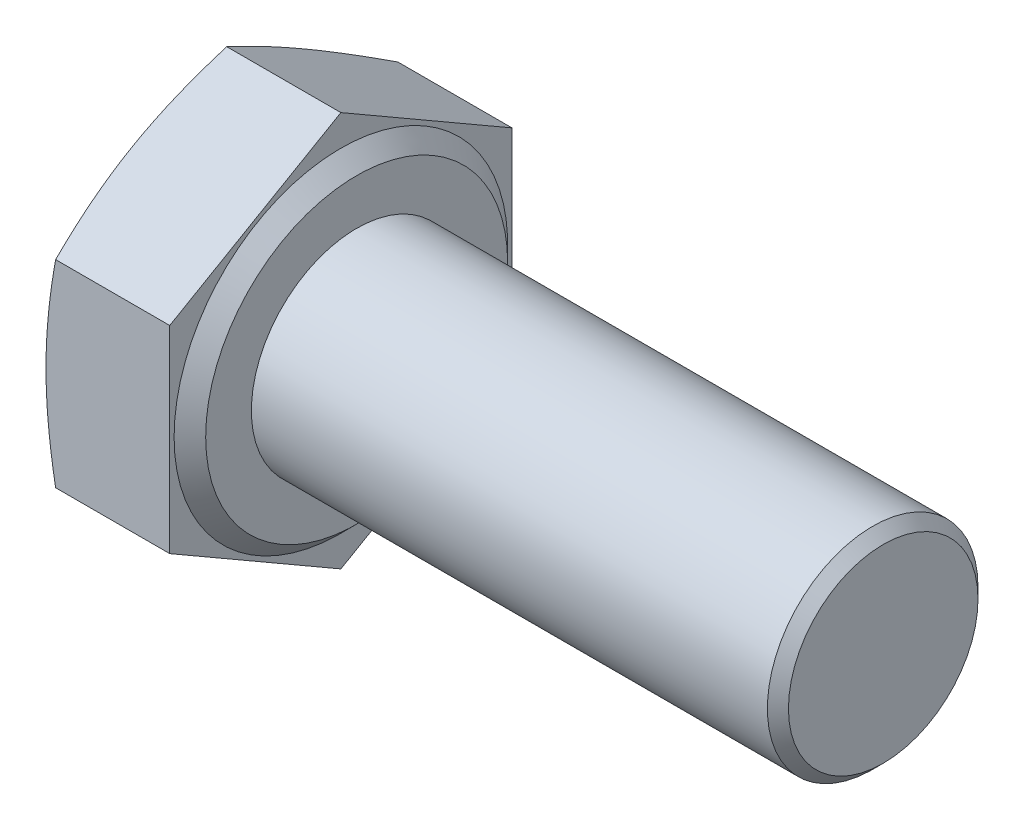
ISO-10303-21;
HEADER;
FILE_DESCRIPTION(('STEP AP214'),'2;1');
FILE_NAME('part.step','',(''),(''),'','','');
FILE_SCHEMA(('AUTOMOTIVE_DESIGN { 1 0 10303 214 1 1 1 1 }'));
ENDSEC;
DATA;
#1=APPLICATION_CONTEXT('core data for automotive mechanical design processes');
#2=APPLICATION_PROTOCOL_DEFINITION('international standard','automotive_design',2000,#1);
#3=PRODUCT_CONTEXT('',#1,'mechanical');
#4=PRODUCT('Part','Part','',(#3));
#5=PRODUCT_RELATED_PRODUCT_CATEGORY('part','',(#4));
#6=PRODUCT_DEFINITION_FORMATION('','',#4);
#7=PRODUCT_DEFINITION_CONTEXT('part definition',#1,'design');
#8=PRODUCT_DEFINITION('design','',#6,#7);
#9=PRODUCT_DEFINITION_SHAPE('','',#8);
#10=(LENGTH_UNIT() NAMED_UNIT(*) SI_UNIT(.MILLI.,.METRE.));
#11=(NAMED_UNIT(*) PLANE_ANGLE_UNIT() SI_UNIT($,.RADIAN.));
#12=(NAMED_UNIT(*) SI_UNIT($,.STERADIAN.) SOLID_ANGLE_UNIT());
#13=UNCERTAINTY_MEASURE_WITH_UNIT(LENGTH_MEASURE(1.E-05),#10,'distance_accuracy_value','');
#14=(GEOMETRIC_REPRESENTATION_CONTEXT(3) GLOBAL_UNCERTAINTY_ASSIGNED_CONTEXT((#13)) GLOBAL_UNIT_ASSIGNED_CONTEXT((#10,
#11,#12)) REPRESENTATION_CONTEXT('',''));
#15=CARTESIAN_POINT('',(0.,0.,0.));
#16=DIRECTION('',(0.,0.,1.));
#17=DIRECTION('',(1.,0.,0.));
#18=AXIS2_PLACEMENT_3D('',#15,#16,#17);
#19=CARTESIAN_POINT('',(5.3,-11.2583302491977,-6.5));
#20=DIRECTION('',(1.,0.,0.));
#21=DIRECTION('',(0.,0.,-1.));
#22=AXIS2_PLACEMENT_3D('',#19,#20,#21);
#23=PLANE('',#22);
#24=CARTESIAN_POINT('',(5.3,0.,0.));
#25=DIRECTION('',(-1.,0.,0.));
#26=DIRECTION('',(0.,0.,1.));
#27=AXIS2_PLACEMENT_3D('',#24,#25,#26);
#28=CIRCLE('',#27,5.735);
#29=CARTESIAN_POINT('',(5.3,0.,5.735));
#30=VERTEX_POINT('',#29);
#31=EDGE_CURVE('E253',#30,#30,#28,.T.);
#32=ORIENTED_EDGE('',*,*,#31,.F.);
#33=EDGE_LOOP('',(#32));
#34=FACE_BOUND('',#33,.T.);
#35=CARTESIAN_POINT('',(5.3,0.,0.));
#36=DIRECTION('',(1.,0.,0.));
#37=DIRECTION('',(0.,0.,-1.));
#38=AXIS2_PLACEMENT_3D('',#35,#36,#37);
#39=CIRCLE('',#38,4.);
#40=CARTESIAN_POINT('',(5.3,0.,-4.));
#41=VERTEX_POINT('',#40);
#42=EDGE_CURVE('E381',#41,#41,#39,.T.);
#43=ORIENTED_EDGE('',*,*,#42,.F.);
#44=EDGE_LOOP('',(#43));
#45=FACE_BOUND('',#44,.T.);
#46=ADVANCED_FACE('F36',(#34,#45),#23,.T.);
#47=CARTESIAN_POINT('',(5.3,-3.75277674973257,6.5));
#48=DIRECTION('',(0.,0.866025403784439,-0.5));
#49=DIRECTION('',(0.,0.5,0.866025403784439));
#50=AXIS2_PLACEMENT_3D('',#47,#48,#49);
#51=PLANE('',#50);
#52=CARTESIAN_POINT('',(0.366033571399917,-7.50566896951897,-0.000199999999999111));
#53=CARTESIAN_POINT('',(0.309444020524644,-7.35024872046989,0.268995767878022));
#54=CARTESIAN_POINT('',(0.257966025840877,-7.19431596160415,0.53907922879786));
#55=CARTESIAN_POINT('',(0.167398453510307,-6.88143655010517,1.08100226615635));
#56=CARTESIAN_POINT('',(0.128318569974497,-6.72448920151499,1.35284304802776));
#57=CARTESIAN_POINT('',(0.0651079760464742,-6.41132237124561,1.89526390929962));
#58=CARTESIAN_POINT('',(0.0408393932631412,-6.25511004161362,2.16583160099093));
#59=CARTESIAN_POINT('',(0.00828840244356363,-5.94232007682223,2.70759971210731));
#60=CARTESIAN_POINT('',(0.,-5.78574260071054,2.97879985605365));
#61=CARTESIAN_POINT('',(0.,-5.47258764848716,3.52120014394635));
#62=CARTESIAN_POINT('',(0.00828840244356352,-5.31601017237547,3.79240028789269));
#63=CARTESIAN_POINT('',(0.0408393932631413,-5.00322020758407,4.33416839900907));
#64=CARTESIAN_POINT('',(0.0651079760464745,-4.84700787795208,4.60473609070038));
#65=CARTESIAN_POINT('',(0.128318569974498,-4.53384104768271,5.14715695197224));
#66=CARTESIAN_POINT('',(0.167398453510307,-4.37689369909253,5.41899773384365));
#67=CARTESIAN_POINT('',(0.257966025840878,-4.06401428759354,5.96092077120214));
#68=CARTESIAN_POINT('',(0.309444020524644,-3.90808152872781,6.23100423212198));
#69=CARTESIAN_POINT('',(0.366033571399917,-3.75266127967873,6.5002));
#70=B_SPLINE_CURVE_WITH_KNOTS('',3,(#52,#53,#54,#55,#56,#57,#58,#59,#60,#61,#62,#63,#64,#65,#66,
#67,#68,#69),.UNSPECIFIED.,.F.,.F.,(4,2,2,2,2,2,2,2,4),(0.,0.947946776379686,1.89663293805397,
2.83634783106806,3.77571015417899,4.71507247728992,5.65478737030401,6.6034735319783,
7.55142030835798),.UNSPECIFIED.);
#71=CARTESIAN_POINT('',(0.365991542767518,-7.50555349946513,0.));
#72=VERTEX_POINT('',#71);
#73=CARTESIAN_POINT('',(0.,-5.62916512459885,3.25));
#74=VERTEX_POINT('',#73);
#75=EDGE_CURVE('E170',#72,#74,#70,.T.);
#76=ORIENTED_EDGE('',*,*,#75,.F.);
#77=DIRECTION('',(-1.,0.,0.));
#78=VECTOR('',#77,1.);
#79=CARTESIAN_POINT('',(5.3,-7.50555349946513,0.));
#80=LINE('',#79,#78);
#81=CARTESIAN_POINT('',(4.7,-7.50555349946513,0.));
#82=VERTEX_POINT('',#81);
#83=EDGE_CURVE('E145',#82,#72,#80,.T.);
#84=ORIENTED_EDGE('',*,*,#83,.F.);
#85=DIRECTION('',(0.,-0.5,-0.866025403784439));
#86=VECTOR('',#85,1.);
#87=CARTESIAN_POINT('',(4.7,-3.75277674973257,6.5));
#88=LINE('',#87,#86);
#89=CARTESIAN_POINT('',(4.7,-3.75277674973257,6.5));
#90=VERTEX_POINT('',#89);
#91=EDGE_CURVE('E136',#90,#82,#88,.T.);
#92=ORIENTED_EDGE('',*,*,#91,.F.);
#93=DIRECTION('',(-1.,0.,0.));
#94=VECTOR('',#93,1.);
#95=CARTESIAN_POINT('',(5.3,-3.75277674973257,6.5));
#96=LINE('',#95,#94);
#97=CARTESIAN_POINT('',(0.365991542767518,-3.75277674973257,6.5));
#98=VERTEX_POINT('',#97);
#99=EDGE_CURVE('E131',#90,#98,#96,.T.);
#100=ORIENTED_EDGE('',*,*,#99,.T.);
#101=EDGE_CURVE('E124',#74,#98,#70,.T.);
#102=ORIENTED_EDGE('',*,*,#101,.F.);
#103=EDGE_LOOP('',(#76,#84,#92,#100,#102));
#104=FACE_BOUND('',#103,.T.);
#105=ADVANCED_FACE('F233',(#104),#51,.F.);
#106=CARTESIAN_POINT('',(5.3,-7.50555349946513,0.));
#107=DIRECTION('',(0.,0.866025403784439,0.5));
#108=DIRECTION('',(0.,-0.5,0.866025403784439));
#109=AXIS2_PLACEMENT_3D('',#106,#107,#108);
#110=PLANE('',#109);
#111=CARTESIAN_POINT('',(0.366033571399918,-3.75266127967873,-6.5002));
#112=CARTESIAN_POINT('',(0.309444020524644,-3.90808152872781,-6.23100423212198));
#113=CARTESIAN_POINT('',(0.257966025840878,-4.06401428759355,-5.96092077120214));
#114=CARTESIAN_POINT('',(0.167398453510308,-4.37689369909253,-5.41899773384365));
#115=CARTESIAN_POINT('',(0.128318569974498,-4.53384104768271,-5.14715695197224));
#116=CARTESIAN_POINT('',(0.0651079760464751,-4.84700787795209,-4.60473609070038));
#117=CARTESIAN_POINT('',(0.0408393932631418,-5.00322020758408,-4.33416839900907));
#118=CARTESIAN_POINT('',(0.00828840244356392,-5.31601017237547,-3.79240028789269));
#119=CARTESIAN_POINT('',(0.,-5.47258764848716,-3.52120014394635));
#120=CARTESIAN_POINT('',(0.,-5.78574260071054,-2.97879985605365));
#121=CARTESIAN_POINT('',(0.00828840244356391,-5.94232007682223,-2.7075997121073));
#122=CARTESIAN_POINT('',(0.0408393932631417,-6.25511004161362,-2.16583160099092));
#123=CARTESIAN_POINT('',(0.0651079760464749,-6.41132237124561,-1.89526390929962));
#124=CARTESIAN_POINT('',(0.128318569974498,-6.72448920151499,-1.35284304802776));
#125=CARTESIAN_POINT('',(0.167398453510307,-6.88143655010517,-1.08100226615635));
#126=CARTESIAN_POINT('',(0.257966025840877,-7.19431596160415,-0.539079228797858));
#127=CARTESIAN_POINT('',(0.309444020524644,-7.35024872046989,-0.26899576787802));
#128=CARTESIAN_POINT('',(0.366033571399917,-7.50566896951897,0.000200000000000513));
#129=B_SPLINE_CURVE_WITH_KNOTS('',3,(#111,#112,#113,#114,#115,#116,#117,#118,#119,#120,#121,
#122,#123,#124,#125,#126,#127,#128),.UNSPECIFIED.,.F.,.F.,(4,2,2,2,2,2,2,2,4),(0.,
0.947946776379686,1.89663293805397,2.83634783106806,3.77571015417899,4.71507247728992,
5.65478737030401,6.6034735319783,7.55142030835798),.UNSPECIFIED.);
#130=CARTESIAN_POINT('',(0.365991542767518,-3.75277674973257,-6.5));
#131=VERTEX_POINT('',#130);
#132=CARTESIAN_POINT('',(0.,-5.62916512459885,-3.25));
#133=VERTEX_POINT('',#132);
#134=EDGE_CURVE('E176',#131,#133,#129,.T.);
#135=ORIENTED_EDGE('',*,*,#134,.F.);
#136=DIRECTION('',(-1.,0.,0.));
#137=VECTOR('',#136,1.);
#138=CARTESIAN_POINT('',(5.3,-3.75277674973257,-6.5));
#139=LINE('',#138,#137);
#140=CARTESIAN_POINT('',(4.7,-3.75277674973257,-6.5));
#141=VERTEX_POINT('',#140);
#142=EDGE_CURVE('E142',#141,#131,#139,.T.);
#143=ORIENTED_EDGE('',*,*,#142,.F.);
#144=DIRECTION('',(0.,0.5,-0.866025403784439));
#145=VECTOR('',#144,1.);
#146=CARTESIAN_POINT('',(4.7,-7.50555349946513,0.));
#147=LINE('',#146,#145);
#148=EDGE_CURVE('E262',#82,#141,#147,.T.);
#149=ORIENTED_EDGE('',*,*,#148,.F.);
#150=ORIENTED_EDGE('',*,*,#83,.T.);
#151=EDGE_CURVE('E168',#133,#72,#129,.T.);
#152=ORIENTED_EDGE('',*,*,#151,.F.);
#153=EDGE_LOOP('',(#135,#143,#149,#150,#152));
#154=FACE_BOUND('',#153,.T.);
#155=ADVANCED_FACE('F185',(#154),#110,.F.);
#156=CARTESIAN_POINT('',(5.3,-3.75277674973257,-6.5));
#157=DIRECTION('',(0.,0.,1.));
#158=DIRECTION('',(0.,-1.,0.));
#159=AXIS2_PLACEMENT_3D('',#156,#157,#158);
#160=PLANE('',#159);
#161=CARTESIAN_POINT('',(1.95571401153663,-9.93603441979221,-6.5));
#162=CARTESIAN_POINT('',(1.86616567875673,-9.64195086953644,-6.5));
#163=CARTESIAN_POINT('',(1.77766225828461,-9.34754322845582,-6.5));
#164=CARTESIAN_POINT('',(1.60332328599293,-8.75791476814704,-6.5));
#165=CARTESIAN_POINT('',(1.51748794528308,-8.4626938865736,-6.5));
#166=CARTESIAN_POINT('',(1.3489203902146,-7.87076864639478,-6.5));
#167=CARTESIAN_POINT('',(1.26619426431368,-7.57406254766227,-6.5));
#168=CARTESIAN_POINT('',(1.10481363643384,-6.9795466370098,-6.5));
#169=CARTESIAN_POINT('',(1.02615906134927,-6.68173684500988,-6.5));
#170=CARTESIAN_POINT('',(0.874868353864858,-6.0884951603723,-6.5));
#171=CARTESIAN_POINT('',(0.802169973926058,-5.79307922138507,-6.5));
#172=CARTESIAN_POINT('',(0.662962609513869,-5.20077731548877,-6.5));
#173=CARTESIAN_POINT('',(0.596453729200673,-4.90389132392938,-6.5));
#174=CARTESIAN_POINT('',(0.471175956763028,-4.3085828816641,-6.5));
#175=CARTESIAN_POINT('',(0.412404424419993,-4.01016099136059,-6.5));
#176=CARTESIAN_POINT('',(0.304390922908062,-3.41158466459654,-6.5));
#177=CARTESIAN_POINT('',(0.255148634453813,-3.1114302865316,-6.5));
#178=CARTESIAN_POINT('',(0.173069796227443,-2.54318759814721,-6.5));
#179=CARTESIAN_POINT('',(0.139012858796123,-2.2752772220122,-6.5));
#180=CARTESIAN_POINT('',(0.081362576226893,-1.73832361178718,-6.5));
#181=CARTESIAN_POINT('',(0.0577689261779796,-1.46928041093954,-6.5));
#182=CARTESIAN_POINT('',(0.0221814401839781,-0.930606870053421,-6.5));
#183=CARTESIAN_POINT('',(0.0101793995170961,-0.660977080895949,-6.5));
#184=CARTESIAN_POINT('',(-0.00161720684022572,-0.12144774373269,-6.5));
#185=CARTESIAN_POINT('',(-0.00141185873888266,0.148451802354621,-6.5));
#186=CARTESIAN_POINT('',(0.0112271247261067,0.689329214219691,-6.5));
#187=CARTESIAN_POINT('',(0.0237227706095074,0.960305606843374,-6.5));
#188=CARTESIAN_POINT('',(0.0603672970671052,1.50146246694377,-6.5));
#189=CARTESIAN_POINT('',(0.0845164576092169,1.77164291514155,-6.5));
#190=CARTESIAN_POINT('',(0.143338326857308,2.31107447569056,-6.5));
#191=CARTESIAN_POINT('',(0.178020074424773,2.58032458812684,-6.5));
#192=CARTESIAN_POINT('',(0.256500333618585,3.1174778193519,-6.5));
#193=CARTESIAN_POINT('',(0.300298894108137,3.38538093091332,-6.5));
#194=CARTESIAN_POINT('',(0.398107689520772,3.93393795895059,-6.5));
#195=CARTESIAN_POINT('',(0.452535533885652,4.21451675121541,-6.5));
#196=CARTESIAN_POINT('',(0.568396435461318,4.77423349044454,-6.5));
#197=CARTESIAN_POINT('',(0.629830020802258,5.05337132712171,-6.5));
#198=CARTESIAN_POINT('',(0.75841232428275,5.61040510315648,-6.5));
#199=CARTESIAN_POINT('',(0.825562702223159,5.88830065701456,-6.5));
#200=CARTESIAN_POINT('',(0.96448662108934,6.44292100824928,-6.5));
#201=CARTESIAN_POINT('',(1.03626005120185,6.71964583351865,-6.5));
#202=CARTESIAN_POINT('',(1.18365878714095,7.27244327517417,-6.5));
#203=CARTESIAN_POINT('',(1.25928890210724,7.54851460470713,-6.5));
#204=CARTESIAN_POINT('',(1.41363061537329,8.0997961525575,-6.5));
#205=CARTESIAN_POINT('',(1.49234225905049,8.37500635812984,-6.5));
#206=CARTESIAN_POINT('',(1.73221562213793,9.19944034893931,-6.5));
#207=CARTESIAN_POINT('',(1.89714297079544,9.74756777924885,-6.5));
#208=CARTESIAN_POINT('',(2.23202264329116,10.8356483510067,-6.5));
#209=CARTESIAN_POINT('',(2.40189940860558,11.3756249384803,-6.5));
#210=CARTESIAN_POINT('',(2.74647915341987,12.4540613435461,-6.5));
#211=CARTESIAN_POINT('',(2.92118236447534,12.992521086995,-6.5));
#212=CARTESIAN_POINT('',(3.27344634384541,14.0662397055123,-6.5));
#213=CARTESIAN_POINT('',(3.45099375441752,14.6015029735514,-6.5));
#214=CARTESIAN_POINT('',(3.71928521382427,15.4037135281966,-6.5));
#215=CARTESIAN_POINT('',(3.80904043563063,15.6709922356054,-6.5));
#216=CARTESIAN_POINT('',(3.98913165710618,16.2053532221131,-6.5));
#217=CARTESIAN_POINT('',(4.07946765535968,16.472435501689,-6.5));
#218=CARTESIAN_POINT('',(4.17005511154135,16.739432454229,-6.5));
#219=B_SPLINE_CURVE_WITH_KNOTS('',3,(#161,#162,#163,#164,#165,#166,#167,#168,#169,#170,#171,
#172,#173,#174,#175,#176,#177,#178,#179,#180,#181,#182,#183,#184,#185,#186,#187,#188,#189,#190,
#191,#192,#193,#194,#195,#196,#197,#198,#199,#200,#201,#202,#203,#204,#205,#206,#207,#208,#209,
#210,#211,#212,#213,#214,#215,#216,#217,#218),.UNSPECIFIED.,.F.,.F.,(4,2,2,2,2,2,2,2,2,2,2,2,2,
2,2,2,2,2,2,2,2,2,2,2,2,2,2,2,4),(0.,0.922251807914867,1.84457640347734,2.76862182748244,
3.69265065427671,4.60528667929008,5.51793805985192,6.43027720430947,7.34258577477969,
8.15260701482545,8.96260464846418,9.77202853205704,10.5814466995231,11.3949698340379,
12.2085125138762,13.0227553426382,13.8370025355942,14.6943202218969,15.5517025801604,
16.409334723443,17.2669463171694,18.1256547962619,18.9843759251336,20.7015065555132,
22.3996837910258,24.0979426409823,25.7897577219944,26.6355971199987,27.4814344570169),.UNSPECIFIED.);
#220=CARTESIAN_POINT('',(0.365991542767518,3.75277674973257,-6.5));
#221=VERTEX_POINT('',#220);
#222=CARTESIAN_POINT('',(0.,0.,-6.5));
#223=VERTEX_POINT('',#222);
#224=EDGE_CURVE('E267',#221,#223,#219,.F.);
#225=ORIENTED_EDGE('',*,*,#224,.F.);
#226=DIRECTION('',(-1.,0.,0.));
#227=VECTOR('',#226,1.);
#228=CARTESIAN_POINT('',(5.3,3.75277674973257,-6.5));
#229=LINE('',#228,#227);
#230=CARTESIAN_POINT('',(4.7,3.75277674973257,-6.5));
#231=VERTEX_POINT('',#230);
#232=EDGE_CURVE('E133',#231,#221,#229,.T.);
#233=ORIENTED_EDGE('',*,*,#232,.F.);
#234=DIRECTION('',(0.,1.,0.));
#235=VECTOR('',#234,1.);
#236=CARTESIAN_POINT('',(4.7,-3.75277674973257,-6.5));
#237=LINE('',#236,#235);
#238=EDGE_CURVE('E255',#141,#231,#237,.T.);
#239=ORIENTED_EDGE('',*,*,#238,.F.);
#240=ORIENTED_EDGE('',*,*,#142,.T.);
#241=EDGE_CURVE('E179',#223,#131,#219,.F.);
#242=ORIENTED_EDGE('',*,*,#241,.F.);
#243=EDGE_LOOP('',(#225,#233,#239,#240,#242));
#244=FACE_BOUND('',#243,.T.);
#245=ADVANCED_FACE('F241',(#244),#160,.F.);
#246=CARTESIAN_POINT('',(5.3,3.75277674973257,-6.5));
#247=DIRECTION('',(0.,-0.866025403784439,0.5));
#248=DIRECTION('',(0.,-0.5,-0.866025403784439));
#249=AXIS2_PLACEMENT_3D('',#246,#247,#248);
#250=PLANE('',#249);
#251=CARTESIAN_POINT('',(0.366033571399918,7.50566896951897,0.000199999999999762));
#252=CARTESIAN_POINT('',(0.309444020524645,7.35024872046989,-0.268995767878022));
#253=CARTESIAN_POINT('',(0.257966025840879,7.19431596160416,-0.539079228797859));
#254=CARTESIAN_POINT('',(0.167398453510308,6.88143655010517,-1.08100226615635));
#255=CARTESIAN_POINT('',(0.128318569974499,6.72448920151499,-1.35284304802776));
#256=CARTESIAN_POINT('',(0.0651079760464753,6.41132237124562,-1.89526390929962));
#257=CARTESIAN_POINT('',(0.0408393932631422,6.25511004161363,-2.16583160099092));
#258=CARTESIAN_POINT('',(0.00828840244356455,5.94232007682223,-2.7075997121073));
#259=CARTESIAN_POINT('',(0.,5.78574260071054,-2.97879985605365));
#260=CARTESIAN_POINT('',(0.,5.47258764848716,-3.52120014394635));
#261=CARTESIAN_POINT('',(0.0082884024435642,5.31601017237547,-3.79240028789269));
#262=CARTESIAN_POINT('',(0.0408393932631419,5.00322020758408,-4.33416839900907));
#263=CARTESIAN_POINT('',(0.0651079760464753,4.84700787795209,-4.60473609070038));
#264=CARTESIAN_POINT('',(0.128318569974498,4.53384104768271,-5.14715695197224));
#265=CARTESIAN_POINT('',(0.167398453510308,4.37689369909253,-5.41899773384365));
#266=CARTESIAN_POINT('',(0.257966025840878,4.06401428759355,-5.96092077120214));
#267=CARTESIAN_POINT('',(0.309444020524644,3.90808152872781,-6.23100423212198));
#268=CARTESIAN_POINT('',(0.366033571399918,3.75266127967873,-6.5002));
#269=B_SPLINE_CURVE_WITH_KNOTS('',3,(#251,#252,#253,#254,#255,#256,#257,#258,#259,#260,#261,
#262,#263,#264,#265,#266,#267,#268),.UNSPECIFIED.,.F.,.F.,(4,2,2,2,2,2,2,2,4),(0.,
0.947946776379686,1.89663293805397,2.83634783106806,3.77571015417899,4.71507247728992,
5.65478737030401,6.6034735319783,7.55142030835798),.UNSPECIFIED.);
#270=CARTESIAN_POINT('',(0.365991542767518,7.50555349946514,0.));
#271=VERTEX_POINT('',#270);
#272=CARTESIAN_POINT('',(0.,5.62916512459885,-3.25));
#273=VERTEX_POINT('',#272);
#274=EDGE_CURVE('E51',#271,#273,#269,.T.);
#275=ORIENTED_EDGE('',*,*,#274,.F.);
#276=DIRECTION('',(-1.,0.,0.));
#277=VECTOR('',#276,1.);
#278=CARTESIAN_POINT('',(5.3,7.50555349946514,0.));
#279=LINE('',#278,#277);
#280=CARTESIAN_POINT('',(4.7,7.50555349946514,0.));
#281=VERTEX_POINT('',#280);
#282=EDGE_CURVE('E130',#281,#271,#279,.T.);
#283=ORIENTED_EDGE('',*,*,#282,.F.);
#284=DIRECTION('',(0.,0.5,0.866025403784439));
#285=VECTOR('',#284,1.);
#286=CARTESIAN_POINT('',(4.7,3.75277674973257,-6.5));
#287=LINE('',#286,#285);
#288=EDGE_CURVE('E252',#231,#281,#287,.T.);
#289=ORIENTED_EDGE('',*,*,#288,.F.);
#290=ORIENTED_EDGE('',*,*,#232,.T.);
#291=EDGE_CURVE('E182',#273,#221,#269,.T.);
#292=ORIENTED_EDGE('',*,*,#291,.F.);
#293=EDGE_LOOP('',(#275,#283,#289,#290,#292));
#294=FACE_BOUND('',#293,.T.);
#295=ADVANCED_FACE('F248',(#294),#250,.F.);
#296=CARTESIAN_POINT('',(5.3,7.50555349946514,0.));
#297=DIRECTION('',(0.,-0.866025403784439,-0.5));
#298=DIRECTION('',(0.,0.5,-0.866025403784439));
#299=AXIS2_PLACEMENT_3D('',#296,#297,#298);
#300=PLANE('',#299);
#301=CARTESIAN_POINT('',(0.366033571399918,3.75266127967873,6.5002));
#302=CARTESIAN_POINT('',(0.309444020524645,3.90808152872782,6.23100423212198));
#303=CARTESIAN_POINT('',(0.257966025840878,4.06401428759355,5.96092077120214));
#304=CARTESIAN_POINT('',(0.167398453510308,4.37689369909254,5.41899773384365));
#305=CARTESIAN_POINT('',(0.128318569974499,4.53384104768271,5.14715695197224));
#306=CARTESIAN_POINT('',(0.0651079760464755,4.84700787795209,4.60473609070038));
#307=CARTESIAN_POINT('',(0.0408393932631422,5.00322020758408,4.33416839900907));
#308=CARTESIAN_POINT('',(0.00828840244356452,5.31601017237548,3.79240028789269));
#309=CARTESIAN_POINT('',(0.,5.47258764848716,3.52120014394635));
#310=CARTESIAN_POINT('',(0.,5.78574260071054,2.97879985605365));
#311=CARTESIAN_POINT('',(0.00828840244356448,5.94232007682223,2.7075997121073));
#312=CARTESIAN_POINT('',(0.0408393932631421,6.25511004161363,2.16583160099092));
#313=CARTESIAN_POINT('',(0.0651079760464755,6.41132237124562,1.89526390929962));
#314=CARTESIAN_POINT('',(0.128318569974499,6.724489201515,1.35284304802776));
#315=CARTESIAN_POINT('',(0.167398453510308,6.88143655010517,1.08100226615635));
#316=CARTESIAN_POINT('',(0.257966025840879,7.19431596160416,0.539079228797856));
#317=CARTESIAN_POINT('',(0.309444020524645,7.35024872046989,0.268995767878019));
#318=CARTESIAN_POINT('',(0.366033571399918,7.50566896951897,-0.000200000000001495));
#319=B_SPLINE_CURVE_WITH_KNOTS('',3,(#301,#302,#303,#304,#305,#306,#307,#308,#309,#310,#311,
#312,#313,#314,#315,#316,#317,#318),.UNSPECIFIED.,.F.,.F.,(4,2,2,2,2,2,2,2,4),(0.,
0.947946776379686,1.89663293805397,2.83634783106806,3.77571015417899,4.71507247728992,
5.65478737030402,6.6034735319783,7.55142030835798),.UNSPECIFIED.);
#320=CARTESIAN_POINT('',(0.365991542767518,3.75277674973257,6.5));
#321=VERTEX_POINT('',#320);
#322=CARTESIAN_POINT('',(0.,5.62916512459885,3.25));
#323=VERTEX_POINT('',#322);
#324=EDGE_CURVE('E59',#321,#323,#319,.T.);
#325=ORIENTED_EDGE('',*,*,#324,.F.);
#326=DIRECTION('',(-1.,0.,0.));
#327=VECTOR('',#326,1.);
#328=CARTESIAN_POINT('',(5.3,3.75277674973257,6.5));
#329=LINE('',#328,#327);
#330=CARTESIAN_POINT('',(4.7,3.75277674973257,6.5));
#331=VERTEX_POINT('',#330);
#332=EDGE_CURVE('E121',#331,#321,#329,.T.);
#333=ORIENTED_EDGE('',*,*,#332,.F.);
#334=DIRECTION('',(0.,-0.5,0.866025403784439));
#335=VECTOR('',#334,1.);
#336=CARTESIAN_POINT('',(4.7,7.50555349946514,0.));
#337=LINE('',#336,#335);
#338=EDGE_CURVE('E250',#281,#331,#337,.T.);
#339=ORIENTED_EDGE('',*,*,#338,.F.);
#340=ORIENTED_EDGE('',*,*,#282,.T.);
#341=EDGE_CURVE('E123',#323,#271,#319,.T.);
#342=ORIENTED_EDGE('',*,*,#341,.F.);
#343=EDGE_LOOP('',(#325,#333,#339,#340,#342));
#344=FACE_BOUND('',#343,.T.);
#345=ADVANCED_FACE('F119',(#344),#300,.F.);
#346=CARTESIAN_POINT('',(5.3,3.75277674973257,6.5));
#347=DIRECTION('',(0.,0.,-1.));
#348=DIRECTION('',(-1.,0.,0.));
#349=AXIS2_PLACEMENT_3D('',#346,#347,#348);
#350=PLANE('',#349);
#351=CARTESIAN_POINT('',(1.95571366019449,-9.93603326628052,6.5));
#352=CARTESIAN_POINT('',(1.86616534413014,-9.64194976069929,6.5));
#353=CARTESIAN_POINT('',(1.77766194032887,-9.34754216431854,6.5));
#354=CARTESIAN_POINT('',(1.60332300117888,-8.75791379350499,6.5));
#355=CARTESIAN_POINT('',(1.51748767693981,-8.46269295672693,6.5));
#356=CARTESIAN_POINT('',(1.34892015458645,-7.87076780655456,6.5));
#357=CARTESIAN_POINT('',(1.26619404492703,-7.57406175303402,6.5));
#358=CARTESIAN_POINT('',(1.1048134490191,-6.97954593299351,6.5));
#359=CARTESIAN_POINT('',(1.02615888966496,-6.68173618639357,6.5));
#360=CARTESIAN_POINT('',(0.874868212658234,-6.08849459225876,6.5));
#361=CARTESIAN_POINT('',(0.802169847476455,-5.79307869837104,6.5));
#362=CARTESIAN_POINT('',(0.662962511402571,-5.20077688303508,6.5));
#363=CARTESIAN_POINT('',(0.596453644670518,-4.90389093693656,6.5));
#364=CARTESIAN_POINT('',(0.471175897619687,-4.30858258594115,6.5));
#365=CARTESIAN_POINT('',(0.412404377085273,-4.01016074144599,6.5));
#366=CARTESIAN_POINT('',(0.304390896673231,-3.41158450682122,6.5));
#367=CARTESIAN_POINT('',(0.255148617510889,-3.11143017508711,6.5));
#368=CARTESIAN_POINT('',(0.173069786014059,-2.54318752224493,6.5));
#369=CARTESIAN_POINT('',(0.139012848166771,-2.27527713500587,6.5));
#370=CARTESIAN_POINT('',(0.0813625657814456,-1.738323502513,6.5));
#371=CARTESIAN_POINT('',(0.057768916332377,-1.46928029050156,6.5));
#372=CARTESIAN_POINT('',(0.0221814326400004,-0.930606727311483,6.5));
#373=CARTESIAN_POINT('',(0.0101793936737363,-0.66097692701388,6.5));
#374=CARTESIAN_POINT('',(-0.00161720821182384,-0.121447567660371,6.5));
#375=CARTESIAN_POINT('',(-0.00141185733934027,0.148451989477059,6.5));
#376=CARTESIAN_POINT('',(0.0112271326109267,0.689329423740301,6.5));
#377=CARTESIAN_POINT('',(0.0237227822313583,0.960305827710796,6.5));
#378=CARTESIAN_POINT('',(0.0603673168833658,1.50146271031067,6.5));
#379=CARTESIAN_POINT('',(0.0845164818829595,1.77164316966111,6.5));
#380=CARTESIAN_POINT('',(0.143338360513653,2.31107475237115,6.5));
#381=CARTESIAN_POINT('',(0.178020113008005,2.58032487581547,6.5));
#382=CARTESIAN_POINT('',(0.256500382296737,3.11747812890285,6.5));
#383=CARTESIAN_POINT('',(0.300298947954333,3.38538125131852,6.5));
#384=CARTESIAN_POINT('',(0.3981077520473,3.93393829023267,6.5));
#385=CARTESIAN_POINT('',(0.452535599586703,4.21451708257566,6.5));
#386=CARTESIAN_POINT('',(0.568396506983388,4.77423382199686,6.5));
#387=CARTESIAN_POINT('',(0.6298300949707,5.05337165878795,6.5));
#388=CARTESIAN_POINT('',(0.758412403296521,5.61040543509077,6.5));
#389=CARTESIAN_POINT('',(0.825562783435459,5.88830098910306,6.5));
#390=CARTESIAN_POINT('',(0.964486706334887,6.4429213407063,6.5));
#391=CARTESIAN_POINT('',(1.03626013828214,6.71964616618997,6.5));
#392=CARTESIAN_POINT('',(1.18365887757004,7.27244360821656,6.5));
#393=CARTESIAN_POINT('',(1.25928899404845,7.54851493790678,6.5));
#394=CARTESIAN_POINT('',(1.41363071010197,8.0997964861227,6.5));
#395=CARTESIAN_POINT('',(1.4923423550545,8.37500669190332,6.5));
#396=CARTESIAN_POINT('',(1.73221572169175,9.1994406834194,6.5));
#397=CARTESIAN_POINT('',(1.8971430723439,9.74756811429359,6.5));
#398=CARTESIAN_POINT('',(2.2320227472408,10.8356486837444,6.5));
#399=CARTESIAN_POINT('',(2.40189951292265,11.3756252683587,6.5));
#400=CARTESIAN_POINT('',(2.74647925811128,12.4540616678074,6.5));
#401=CARTESIAN_POINT('',(2.92118246917361,12.9925214084985,6.5));
#402=CARTESIAN_POINT('',(3.27344644846169,14.0662400220233,6.5));
#403=CARTESIAN_POINT('',(3.45099385894873,14.6015032878262,6.5));
#404=CARTESIAN_POINT('',(3.71928531810861,15.4037138391588,6.5));
#405=CARTESIAN_POINT('',(3.80904053981336,15.6709925454721,6.5));
#406=CARTESIAN_POINT('',(3.98913176105164,16.2053535297995,6.5));
#407=CARTESIAN_POINT('',(4.0794677591695,16.4724358082908,6.5));
#408=CARTESIAN_POINT('',(4.17005521520151,16.7394327597508,6.5));
#409=B_SPLINE_CURVE_WITH_KNOTS('',3,(#351,#352,#353,#354,#355,#356,#357,#358,#359,#360,#361,
#362,#363,#364,#365,#366,#367,#368,#369,#370,#371,#372,#373,#374,#375,#376,#377,#378,#379,#380,
#381,#382,#383,#384,#385,#386,#387,#388,#389,#390,#391,#392,#393,#394,#395,#396,#397,#398,#399,
#400,#401,#402,#403,#404,#405,#406,#407,#408),.UNSPECIFIED.,.F.,.F.,(4,2,2,2,2,2,2,2,2,2,2,2,2,
2,2,2,2,2,2,2,2,2,2,2,2,2,2,2,4),(0.,0.922251665094893,1.8445761178197,2.76862139808781,
3.69265008115161,4.60528596421703,5.5179372028105,6.43027620562617,7.34258463451264,
8.15260590773143,8.96260357454243,9.77202749125737,10.5814456918456,11.3949688608542,
12.2085115751932,13.0227544385919,13.8370016661854,14.694319354549,15.5517017148634,
16.4093338601525,17.2669454558881,18.1256539366375,18.9843750671642,20.7015057009012,
22.3996829285659,24.0979417706618,25.7897568452273,26.6355962400188,27.4814335738245),.UNSPECIFIED.);
#410=CARTESIAN_POINT('',(0.,0.,6.5));
#411=VERTEX_POINT('',#410);
#412=EDGE_CURVE('E114',#98,#411,#409,.T.);
#413=ORIENTED_EDGE('',*,*,#412,.F.);
#414=ORIENTED_EDGE('',*,*,#99,.F.);
#415=DIRECTION('',(0.,-1.,0.));
#416=VECTOR('',#415,1.);
#417=CARTESIAN_POINT('',(4.7,3.75277674973257,6.5));
#418=LINE('',#417,#416);
#419=EDGE_CURVE('E129',#331,#90,#418,.T.);
#420=ORIENTED_EDGE('',*,*,#419,.F.);
#421=ORIENTED_EDGE('',*,*,#332,.T.);
#422=EDGE_CURVE('E106',#411,#321,#409,.T.);
#423=ORIENTED_EDGE('',*,*,#422,.F.);
#424=EDGE_LOOP('',(#413,#414,#420,#421,#423));
#425=FACE_BOUND('',#424,.T.);
#426=ADVANCED_FACE('F127',(#425),#350,.F.);
#427=CARTESIAN_POINT('',(4.7,6.33500000000001,0.));
#428=DIRECTION('',(1.,0.,0.));
#429=DIRECTION('',(0.,0.,-1.));
#430=AXIS2_PLACEMENT_3D('',#427,#428,#429);
#431=PLANE('',#430);
#432=CARTESIAN_POINT('',(4.7,0.,0.));
#433=DIRECTION('',(-1.,0.,0.));
#434=DIRECTION('',(0.,0.,1.));
#435=AXIS2_PLACEMENT_3D('',#432,#433,#434);
#436=CIRCLE('',#435,6.33500000000001);
#437=CARTESIAN_POINT('',(4.7,0.,6.33500000000001));
#438=VERTEX_POINT('',#437);
#439=EDGE_CURVE('E258',#438,#438,#436,.T.);
#440=ORIENTED_EDGE('',*,*,#439,.T.);
#441=EDGE_LOOP('',(#440));
#442=FACE_BOUND('',#441,.T.);
#443=ORIENTED_EDGE('',*,*,#91,.T.);
#444=ORIENTED_EDGE('',*,*,#148,.T.);
#445=ORIENTED_EDGE('',*,*,#238,.T.);
#446=ORIENTED_EDGE('',*,*,#288,.T.);
#447=ORIENTED_EDGE('',*,*,#338,.T.);
#448=ORIENTED_EDGE('',*,*,#419,.T.);
#449=EDGE_LOOP('',(#443,#444,#445,#446,#447,#448));
#450=FACE_BOUND('',#449,.T.);
#451=ADVANCED_FACE('F214',(#442,#450),#431,.T.);
#452=CARTESIAN_POINT('',(4.7,0.,0.));
#453=DIRECTION('',(-1.,0.,0.));
#454=DIRECTION('',(0.,0.,1.));
#455=AXIS2_PLACEMENT_3D('',#452,#453,#454);
#456=CONICAL_SURFACE('',#455,6.33500000000001,0.785398163397453);
#457=ORIENTED_EDGE('',*,*,#31,.T.);
#458=EDGE_LOOP('',(#457));
#459=FACE_BOUND('',#458,.T.);
#460=ORIENTED_EDGE('',*,*,#439,.F.);
#461=EDGE_LOOP('',(#460));
#462=FACE_BOUND('',#461,.T.);
#463=ADVANCED_FACE('F272',(#459,#462),#456,.T.);
#464=CARTESIAN_POINT('',(0.,0.,0.));
#465=DIRECTION('',(1.,0.,0.));
#466=DIRECTION('',(0.,0.,-1.));
#467=AXIS2_PLACEMENT_3D('',#464,#465,#466);
#468=CONICAL_SURFACE('',#467,6.5,1.22173047639604);
#469=ORIENTED_EDGE('',*,*,#241,.T.);
#470=ORIENTED_EDGE('',*,*,#134,.T.);
#471=CARTESIAN_POINT('',(0.,0.,0.));
#472=DIRECTION('',(1.,0.,0.));
#473=DIRECTION('',(0.,0.,-1.));
#474=AXIS2_PLACEMENT_3D('',#471,#472,#473);
#475=CIRCLE('',#474,6.5);
#476=EDGE_CURVE('E149',#133,#223,#475,.T.);
#477=ORIENTED_EDGE('',*,*,#476,.T.);
#478=EDGE_LOOP('',(#469,#470,#477));
#479=FACE_BOUND('',#478,.T.);
#480=ADVANCED_FACE('F177',(#479),#468,.T.);
#481=ORIENTED_EDGE('',*,*,#151,.T.);
#482=ORIENTED_EDGE('',*,*,#75,.T.);
#483=EDGE_CURVE('E151',#74,#133,#475,.T.);
#484=ORIENTED_EDGE('',*,*,#483,.T.);
#485=EDGE_LOOP('',(#481,#482,#484));
#486=FACE_BOUND('',#485,.T.);
#487=ADVANCED_FACE('F166',(#486),#468,.T.);
#488=ORIENTED_EDGE('',*,*,#101,.T.);
#489=ORIENTED_EDGE('',*,*,#412,.T.);
#490=EDGE_CURVE('E160',#411,#74,#475,.T.);
#491=ORIENTED_EDGE('',*,*,#490,.T.);
#492=EDGE_LOOP('',(#488,#489,#491));
#493=FACE_BOUND('',#492,.T.);
#494=ADVANCED_FACE('F392',(#493),#468,.T.);
#495=ORIENTED_EDGE('',*,*,#324,.T.);
#496=CARTESIAN_POINT('',(0.,0.,0.));
#497=DIRECTION('',(-1.,0.,0.));
#498=DIRECTION('',(0.,0.,1.));
#499=AXIS2_PLACEMENT_3D('',#496,#497,#498);
#500=CIRCLE('',#499,6.5);
#501=EDGE_CURVE('E109',#411,#323,#500,.T.);
#502=ORIENTED_EDGE('',*,*,#501,.F.);
#503=ORIENTED_EDGE('',*,*,#422,.T.);
#504=EDGE_LOOP('',(#495,#502,#503));
#505=FACE_BOUND('',#504,.T.);
#506=ADVANCED_FACE('F107',(#505),#468,.T.);
#507=ORIENTED_EDGE('',*,*,#274,.T.);
#508=EDGE_CURVE('E156',#273,#323,#475,.T.);
#509=ORIENTED_EDGE('',*,*,#508,.T.);
#510=ORIENTED_EDGE('',*,*,#341,.T.);
#511=EDGE_LOOP('',(#507,#509,#510));
#512=FACE_BOUND('',#511,.T.);
#513=ADVANCED_FACE('F211',(#512),#468,.T.);
#514=ORIENTED_EDGE('',*,*,#224,.T.);
#515=EDGE_CURVE('E152',#223,#273,#475,.T.);
#516=ORIENTED_EDGE('',*,*,#515,.T.);
#517=ORIENTED_EDGE('',*,*,#291,.T.);
#518=EDGE_LOOP('',(#514,#516,#517));
#519=FACE_BOUND('',#518,.T.);
#520=ADVANCED_FACE('F206',(#519),#468,.T.);
#521=CARTESIAN_POINT('',(0.,-11.2583302491977,-6.5));
#522=DIRECTION('',(1.,0.,0.));
#523=DIRECTION('',(0.,0.,-1.));
#524=AXIS2_PLACEMENT_3D('',#521,#522,#523);
#525=PLANE('',#524);
#526=ORIENTED_EDGE('',*,*,#515,.F.);
#527=ORIENTED_EDGE('',*,*,#476,.F.);
#528=ORIENTED_EDGE('',*,*,#483,.F.);
#529=ORIENTED_EDGE('',*,*,#490,.F.);
#530=ORIENTED_EDGE('',*,*,#501,.T.);
#531=ORIENTED_EDGE('',*,*,#508,.F.);
#532=EDGE_LOOP('',(#526,#527,#528,#529,#530,#531));
#533=FACE_BOUND('',#532,.T.);
#534=ADVANCED_FACE('F184',(#533),#525,.F.);
#535=CARTESIAN_POINT('',(25.3,0.,0.));
#536=DIRECTION('',(-1.,0.,0.));
#537=DIRECTION('',(0.,0.,1.));
#538=AXIS2_PLACEMENT_3D('',#535,#536,#537);
#539=CYLINDRICAL_SURFACE('',#538,4.);
#540=CARTESIAN_POINT('',(24.9,0.,0.));
#541=DIRECTION('',(1.,0.,0.));
#542=DIRECTION('',(0.,0.,-1.));
#543=AXIS2_PLACEMENT_3D('',#540,#541,#542);
#544=CIRCLE('',#543,4.);
#545=CARTESIAN_POINT('',(24.9,0.,-4.));
#546=VERTEX_POINT('',#545);
#547=EDGE_CURVE('E11',#546,#546,#544,.F.);
#548=ORIENTED_EDGE('',*,*,#547,.T.);
#549=EDGE_LOOP('',(#548));
#550=FACE_BOUND('',#549,.T.);
#551=ORIENTED_EDGE('',*,*,#42,.T.);
#552=EDGE_LOOP('',(#551));
#553=FACE_BOUND('',#552,.T.);
#554=ADVANCED_FACE('F212',(#550,#553),#539,.T.);
#555=CARTESIAN_POINT('',(25.3,0.,0.));
#556=DIRECTION('',(1.,0.,0.));
#557=DIRECTION('',(0.,0.,-1.));
#558=AXIS2_PLACEMENT_3D('',#555,#556,#557);
#559=PLANE('',#558);
#560=CARTESIAN_POINT('',(25.3,0.,0.));
#561=DIRECTION('',(1.,0.,0.));
#562=DIRECTION('',(0.,0.,-1.));
#563=AXIS2_PLACEMENT_3D('',#560,#561,#562);
#564=CIRCLE('',#563,3.59999999999999);
#565=CARTESIAN_POINT('',(25.3,0.,-3.59999999999999));
#566=VERTEX_POINT('',#565);
#567=EDGE_CURVE('E44',#566,#566,#564,.T.);
#568=ORIENTED_EDGE('',*,*,#567,.T.);
#569=EDGE_LOOP('',(#568));
#570=FACE_BOUND('',#569,.T.);
#571=ADVANCED_FACE('F357',(#570),#559,.T.);
#572=CARTESIAN_POINT('',(25.3,0.,0.));
#573=DIRECTION('',(-1.,0.,0.));
#574=DIRECTION('',(0.,0.,1.));
#575=AXIS2_PLACEMENT_3D('',#572,#573,#574);
#576=CONICAL_SURFACE('',#575,3.59999999999999,0.785398163397444);
#577=ORIENTED_EDGE('',*,*,#547,.F.);
#578=EDGE_LOOP('',(#577));
#579=FACE_BOUND('',#578,.T.);
#580=ORIENTED_EDGE('',*,*,#567,.F.);
#581=EDGE_LOOP('',(#580));
#582=FACE_BOUND('',#581,.T.);
#583=ADVANCED_FACE('F38',(#579,#582),#576,.T.);
#584=CLOSED_SHELL('',(#46,#105,#155,#245,#295,#345,#426,#451,#463,#480,#487,#494,#506,#513,#520,
#534,#554,#571,#583));
#585=MANIFOLD_SOLID_BREP('B2',#584);
#586=ADVANCED_BREP_SHAPE_REPRESENTATION('',(#18,#585),#14);
#587=SHAPE_DEFINITION_REPRESENTATION(#9,#586);
ENDSEC;
END-ISO-10303-21;
